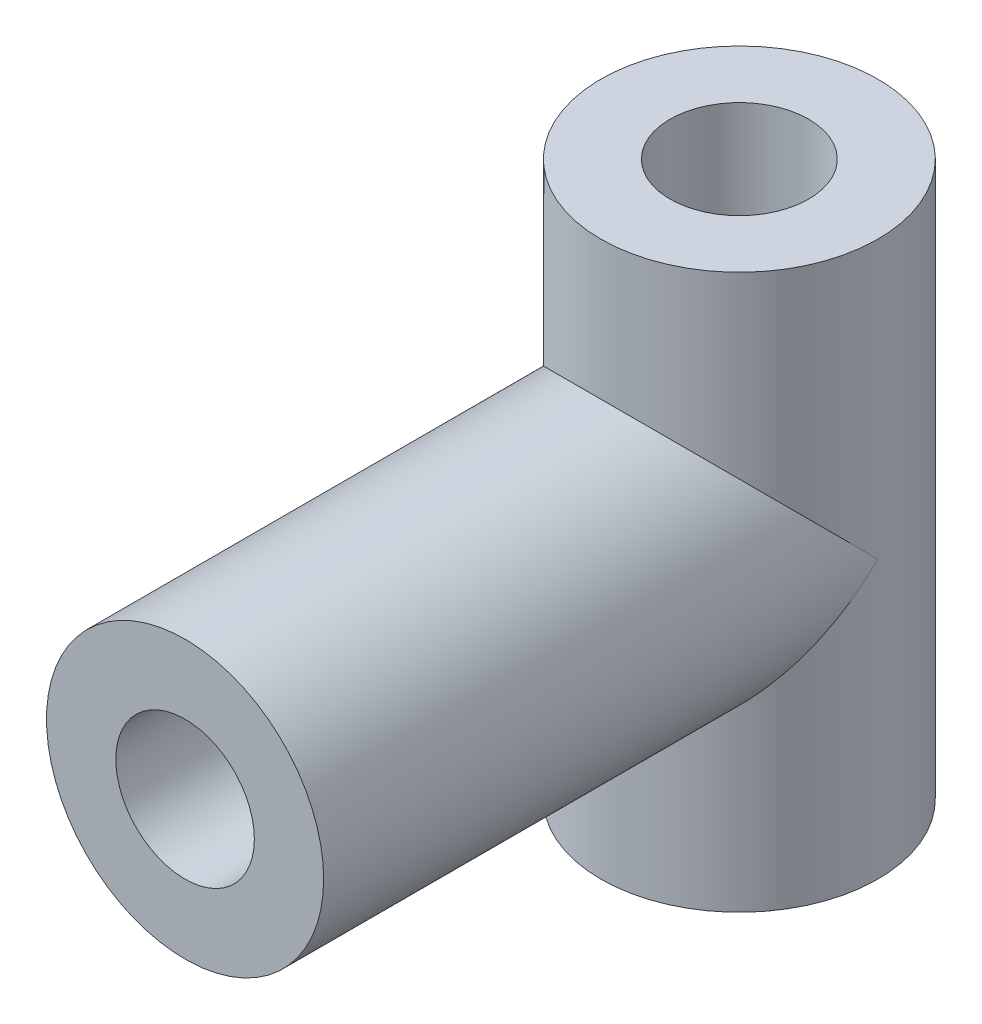
ISO-10303-21;
HEADER;
FILE_DESCRIPTION(('STEP AP214'),'2;1');
FILE_NAME('part.step','',(''),(''),'','','');
FILE_SCHEMA(('AUTOMOTIVE_DESIGN { 1 0 10303 214 1 1 1 1 }'));
ENDSEC;
DATA;
#1=APPLICATION_CONTEXT('core data for automotive mechanical design processes');
#2=APPLICATION_PROTOCOL_DEFINITION('international standard','automotive_design',2000,#1);
#3=PRODUCT_CONTEXT('',#1,'mechanical');
#4=PRODUCT('Part','Part','',(#3));
#5=PRODUCT_RELATED_PRODUCT_CATEGORY('part','',(#4));
#6=PRODUCT_DEFINITION_FORMATION('','',#4);
#7=PRODUCT_DEFINITION_CONTEXT('part definition',#1,'design');
#8=PRODUCT_DEFINITION('design','',#6,#7);
#9=PRODUCT_DEFINITION_SHAPE('','',#8);
#10=(LENGTH_UNIT() NAMED_UNIT(*) SI_UNIT(.MILLI.,.METRE.));
#11=(NAMED_UNIT(*) PLANE_ANGLE_UNIT() SI_UNIT($,.RADIAN.));
#12=(NAMED_UNIT(*) SI_UNIT($,.STERADIAN.) SOLID_ANGLE_UNIT());
#13=UNCERTAINTY_MEASURE_WITH_UNIT(LENGTH_MEASURE(1.E-05),#10,'distance_accuracy_value','');
#14=(GEOMETRIC_REPRESENTATION_CONTEXT(3) GLOBAL_UNCERTAINTY_ASSIGNED_CONTEXT((#13)) GLOBAL_UNIT_ASSIGNED_CONTEXT((#10,
#11,#12)) REPRESENTATION_CONTEXT('',''));
#15=CARTESIAN_POINT('',(0.,0.,0.));
#16=DIRECTION('',(0.,0.,1.));
#17=DIRECTION('',(1.,0.,0.));
#18=AXIS2_PLACEMENT_3D('',#15,#16,#17);
#19=CARTESIAN_POINT('',(0.,10.,0.));
#20=DIRECTION('',(0.,-1.,0.));
#21=DIRECTION('',(0.,0.,-1.));
#22=AXIS2_PLACEMENT_3D('',#19,#20,#21);
#23=CYLINDRICAL_SURFACE('',#22,5.);
#24=CARTESIAN_POINT('',(0.,-10.,0.));
#25=DIRECTION('',(0.,1.,0.));
#26=DIRECTION('',(0.,0.,1.));
#27=AXIS2_PLACEMENT_3D('',#24,#25,#26);
#28=CIRCLE('',#27,5.);
#29=CARTESIAN_POINT('',(0.,-10.,5.));
#30=VERTEX_POINT('',#29);
#31=EDGE_CURVE('E59',#30,#30,#28,.T.);
#32=ORIENTED_EDGE('',*,*,#31,.T.);
#33=EDGE_LOOP('',(#32));
#34=FACE_BOUND('',#33,.T.);
#35=CARTESIAN_POINT('',(0.,10.,0.));
#36=DIRECTION('',(0.,1.,0.));
#37=DIRECTION('',(0.,0.,1.));
#38=AXIS2_PLACEMENT_3D('',#35,#36,#37);
#39=CIRCLE('',#38,5.);
#40=CARTESIAN_POINT('',(0.,10.,5.));
#41=VERTEX_POINT('',#40);
#42=EDGE_CURVE('E56',#41,#41,#39,.T.);
#43=ORIENTED_EDGE('',*,*,#42,.F.);
#44=EDGE_LOOP('',(#43));
#45=FACE_BOUND('',#44,.T.);
#46=CARTESIAN_POINT('',(0.,0.,0.));
#47=DIRECTION('',(0.,-0.707106781186547,-0.707106781186547));
#48=DIRECTION('',(0.,-0.707106781186547,0.707106781186547));
#49=AXIS2_PLACEMENT_3D('',#46,#47,#48);
#50=ELLIPSE('',#49,7.07106781186547,5.);
#51=CARTESIAN_POINT('',(-5.,0.,0.));
#52=VERTEX_POINT('',#51);
#53=CARTESIAN_POINT('',(5.,0.,0.));
#54=VERTEX_POINT('',#53);
#55=EDGE_CURVE('E11',#52,#54,#50,.F.);
#56=ORIENTED_EDGE('',*,*,#55,.F.);
#57=CARTESIAN_POINT('',(0.,0.,0.));
#58=DIRECTION('',(0.,-0.707106781186547,0.707106781186547));
#59=DIRECTION('',(0.,-0.707106781186547,-0.707106781186547));
#60=AXIS2_PLACEMENT_3D('',#57,#58,#59);
#61=ELLIPSE('',#60,7.07106781186547,5.);
#62=EDGE_CURVE('E47',#54,#52,#61,.T.);
#63=ORIENTED_EDGE('',*,*,#62,.F.);
#64=EDGE_LOOP('',(#56,#63));
#65=FACE_BOUND('',#64,.T.);
#66=ADVANCED_FACE('F39',(#34,#45,#65),#23,.T.);
#67=CARTESIAN_POINT('',(0.,10.,0.));
#68=DIRECTION('',(0.,1.,0.));
#69=DIRECTION('',(0.,0.,1.));
#70=AXIS2_PLACEMENT_3D('',#67,#68,#69);
#71=PLANE('',#70);
#72=CARTESIAN_POINT('',(0.,10.,0.));
#73=DIRECTION('',(0.,-1.,0.));
#74=DIRECTION('',(0.,0.,-1.));
#75=AXIS2_PLACEMENT_3D('',#72,#73,#74);
#76=CIRCLE('',#75,2.5);
#77=CARTESIAN_POINT('',(0.,10.,-2.5));
#78=VERTEX_POINT('',#77);
#79=EDGE_CURVE('E74',#78,#78,#76,.T.);
#80=ORIENTED_EDGE('',*,*,#79,.T.);
#81=EDGE_LOOP('',(#80));
#82=FACE_BOUND('',#81,.T.);
#83=ORIENTED_EDGE('',*,*,#42,.T.);
#84=EDGE_LOOP('',(#83));
#85=FACE_BOUND('',#84,.T.);
#86=ADVANCED_FACE('F86',(#82,#85),#71,.T.);
#87=CARTESIAN_POINT('',(0.,-10.,0.));
#88=DIRECTION('',(0.,1.,0.));
#89=DIRECTION('',(0.,0.,1.));
#90=AXIS2_PLACEMENT_3D('',#87,#88,#89);
#91=PLANE('',#90);
#92=CARTESIAN_POINT('',(0.,-10.,0.));
#93=DIRECTION('',(0.,-1.,0.));
#94=DIRECTION('',(0.,0.,-1.));
#95=AXIS2_PLACEMENT_3D('',#92,#93,#94);
#96=CIRCLE('',#95,2.5);
#97=CARTESIAN_POINT('',(0.,-10.,-2.5));
#98=VERTEX_POINT('',#97);
#99=EDGE_CURVE('E78',#98,#98,#96,.T.);
#100=ORIENTED_EDGE('',*,*,#99,.F.);
#101=EDGE_LOOP('',(#100));
#102=FACE_BOUND('',#101,.T.);
#103=ORIENTED_EDGE('',*,*,#31,.F.);
#104=EDGE_LOOP('',(#103));
#105=FACE_BOUND('',#104,.T.);
#106=ADVANCED_FACE('F96',(#102,#105),#91,.F.);
#107=CARTESIAN_POINT('',(0.,0.,20.));
#108=DIRECTION('',(0.,0.,-1.));
#109=DIRECTION('',(-1.,0.,0.));
#110=AXIS2_PLACEMENT_3D('',#107,#108,#109);
#111=CYLINDRICAL_SURFACE('',#110,5.);
#112=CARTESIAN_POINT('',(0.,0.,20.));
#113=DIRECTION('',(0.,0.,1.));
#114=DIRECTION('',(1.,0.,0.));
#115=AXIS2_PLACEMENT_3D('',#112,#113,#114);
#116=CIRCLE('',#115,5.);
#117=CARTESIAN_POINT('',(5.,0.,20.));
#118=VERTEX_POINT('',#117);
#119=EDGE_CURVE('E64',#118,#118,#116,.T.);
#120=ORIENTED_EDGE('',*,*,#119,.F.);
#121=EDGE_LOOP('',(#120));
#122=FACE_BOUND('',#121,.T.);
#123=ORIENTED_EDGE('',*,*,#62,.T.);
#124=ORIENTED_EDGE('',*,*,#55,.T.);
#125=EDGE_LOOP('',(#123,#124));
#126=FACE_BOUND('',#125,.T.);
#127=ADVANCED_FACE('F54',(#122,#126),#111,.T.);
#128=CARTESIAN_POINT('',(0.,0.,20.));
#129=DIRECTION('',(0.,0.,1.));
#130=DIRECTION('',(1.,0.,0.));
#131=AXIS2_PLACEMENT_3D('',#128,#129,#130);
#132=PLANE('',#131);
#133=CARTESIAN_POINT('',(0.,0.,20.));
#134=DIRECTION('',(0.,0.,1.));
#135=DIRECTION('',(1.,0.,0.));
#136=AXIS2_PLACEMENT_3D('',#133,#134,#135);
#137=CIRCLE('',#136,2.5);
#138=CARTESIAN_POINT('',(2.5,0.,20.));
#139=VERTEX_POINT('',#138);
#140=EDGE_CURVE('E70',#139,#139,#137,.T.);
#141=ORIENTED_EDGE('',*,*,#140,.F.);
#142=EDGE_LOOP('',(#141));
#143=FACE_BOUND('',#142,.T.);
#144=ORIENTED_EDGE('',*,*,#119,.T.);
#145=EDGE_LOOP('',(#144));
#146=FACE_BOUND('',#145,.T.);
#147=ADVANCED_FACE('F111',(#143,#146),#132,.T.);
#148=CARTESIAN_POINT('',(0.,0.,5.));
#149=DIRECTION('',(0.,0.,1.));
#150=DIRECTION('',(1.,0.,0.));
#151=AXIS2_PLACEMENT_3D('',#148,#149,#150);
#152=CYLINDRICAL_SURFACE('',#151,2.5);
#153=CARTESIAN_POINT('',(0.,0.,5.));
#154=DIRECTION('',(0.,0.,1.));
#155=DIRECTION('',(1.,0.,0.));
#156=AXIS2_PLACEMENT_3D('',#153,#154,#155);
#157=CIRCLE('',#156,2.5);
#158=CARTESIAN_POINT('',(2.5,0.,5.));
#159=VERTEX_POINT('',#158);
#160=EDGE_CURVE('E69',#159,#159,#157,.T.);
#161=ORIENTED_EDGE('',*,*,#160,.F.);
#162=EDGE_LOOP('',(#161));
#163=FACE_BOUND('',#162,.T.);
#164=ORIENTED_EDGE('',*,*,#140,.T.);
#165=EDGE_LOOP('',(#164));
#166=FACE_BOUND('',#165,.T.);
#167=ADVANCED_FACE('F115',(#163,#166),#152,.F.);
#168=CARTESIAN_POINT('',(0.,0.,5.));
#169=DIRECTION('',(0.,0.,1.));
#170=DIRECTION('',(1.,0.,0.));
#171=AXIS2_PLACEMENT_3D('',#168,#169,#170);
#172=PLANE('',#171);
#173=ORIENTED_EDGE('',*,*,#160,.T.);
#174=EDGE_LOOP('',(#173));
#175=FACE_BOUND('',#174,.T.);
#176=ADVANCED_FACE('F92',(#175),#172,.T.);
#177=CARTESIAN_POINT('',(0.,10.,0.));
#178=DIRECTION('',(0.,-1.,0.));
#179=DIRECTION('',(0.,0.,-1.));
#180=AXIS2_PLACEMENT_3D('',#177,#178,#179);
#181=CYLINDRICAL_SURFACE('',#180,2.5);
#182=ORIENTED_EDGE('',*,*,#79,.F.);
#183=EDGE_LOOP('',(#182));
#184=FACE_BOUND('',#183,.T.);
#185=ORIENTED_EDGE('',*,*,#99,.T.);
#186=EDGE_LOOP('',(#185));
#187=FACE_BOUND('',#186,.T.);
#188=ADVANCED_FACE('F89',(#184,#187),#181,.F.);
#189=CLOSED_SHELL('',(#66,#86,#106,#127,#147,#167,#176,#188));
#190=MANIFOLD_SOLID_BREP('B2',#189);
#191=ADVANCED_BREP_SHAPE_REPRESENTATION('',(#18,#190),#14);
#192=SHAPE_DEFINITION_REPRESENTATION(#9,#191);
ENDSEC;
END-ISO-10303-21;
